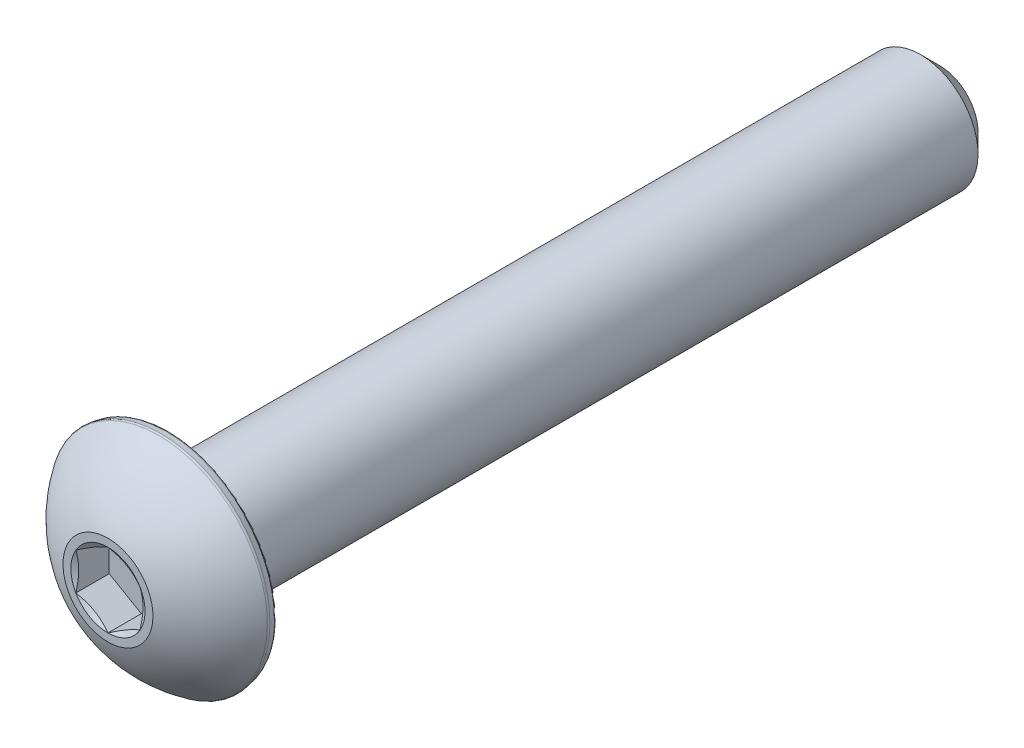
ISO-10303-21;
HEADER;
FILE_DESCRIPTION(('STEP AP214'),'2;1');
FILE_NAME('part.step','',(''),(''),'','','');
FILE_SCHEMA(('AUTOMOTIVE_DESIGN { 1 0 10303 214 1 1 1 1 }'));
ENDSEC;
DATA;
#1=APPLICATION_CONTEXT('core data for automotive mechanical design processes');
#2=APPLICATION_PROTOCOL_DEFINITION('international standard','automotive_design',2000,#1);
#3=PRODUCT_CONTEXT('',#1,'mechanical');
#4=PRODUCT('Part','Part','',(#3));
#5=PRODUCT_RELATED_PRODUCT_CATEGORY('part','',(#4));
#6=PRODUCT_DEFINITION_FORMATION('','',#4);
#7=PRODUCT_DEFINITION_CONTEXT('part definition',#1,'design');
#8=PRODUCT_DEFINITION('design','',#6,#7);
#9=PRODUCT_DEFINITION_SHAPE('','',#8);
#10=(LENGTH_UNIT() NAMED_UNIT(*) SI_UNIT(.MILLI.,.METRE.));
#11=(NAMED_UNIT(*) PLANE_ANGLE_UNIT() SI_UNIT($,.RADIAN.));
#12=(NAMED_UNIT(*) SI_UNIT($,.STERADIAN.) SOLID_ANGLE_UNIT());
#13=UNCERTAINTY_MEASURE_WITH_UNIT(LENGTH_MEASURE(1.E-05),#10,'distance_accuracy_value','');
#14=(GEOMETRIC_REPRESENTATION_CONTEXT(3) GLOBAL_UNCERTAINTY_ASSIGNED_CONTEXT((#13)) GLOBAL_UNIT_ASSIGNED_CONTEXT((#10,
#11,#12)) REPRESENTATION_CONTEXT('',''));
#15=CARTESIAN_POINT('',(0.,0.,0.));
#16=DIRECTION('',(0.,0.,1.));
#17=DIRECTION('',(1.,0.,0.));
#18=AXIS2_PLACEMENT_3D('',#15,#16,#17);
#19=CARTESIAN_POINT('',(0.,0.946150000000001,-19.05));
#20=DIRECTION('',(0.,0.,-1.));
#21=DIRECTION('',(0.,1.,0.));
#22=AXIS2_PLACEMENT_3D('',#19,#20,#21);
#23=PLANE('',#22);
#24=CARTESIAN_POINT('',(0.,0.,-19.05));
#25=DIRECTION('',(0.,0.,-1.));
#26=DIRECTION('',(0.,1.,0.));
#27=AXIS2_PLACEMENT_3D('',#24,#25,#26);
#28=CIRCLE('',#27,0.946150000000001);
#29=CARTESIAN_POINT('',(0.,0.946150000000001,-19.05));
#30=VERTEX_POINT('',#29);
#31=EDGE_CURVE('E108',#30,#30,#28,.T.);
#32=ORIENTED_EDGE('',*,*,#31,.T.);
#33=EDGE_LOOP('',(#32));
#34=FACE_BOUND('',#33,.T.);
#35=ADVANCED_FACE('F35',(#34),#23,.T.);
#36=CARTESIAN_POINT('',(0.,0.,-19.05));
#37=DIRECTION('',(0.,0.,1.));
#38=DIRECTION('',(0.,-1.,0.));
#39=AXIS2_PLACEMENT_3D('',#36,#37,#38);
#40=CONICAL_SURFACE('',#39,0.946150000000001,0.785398163397444);
#41=CARTESIAN_POINT('',(0.,0.,-18.57375));
#42=DIRECTION('',(0.,0.,-1.));
#43=DIRECTION('',(0.,1.,0.));
#44=AXIS2_PLACEMENT_3D('',#41,#42,#43);
#45=CIRCLE('',#44,1.4224);
#46=CARTESIAN_POINT('',(0.,1.4224,-18.57375));
#47=VERTEX_POINT('',#46);
#48=EDGE_CURVE('E207',#47,#47,#45,.T.);
#49=ORIENTED_EDGE('',*,*,#48,.T.);
#50=EDGE_LOOP('',(#49));
#51=FACE_BOUND('',#50,.T.);
#52=ORIENTED_EDGE('',*,*,#31,.F.);
#53=EDGE_LOOP('',(#52));
#54=FACE_BOUND('',#53,.T.);
#55=ADVANCED_FACE('F264',(#51,#54),#40,.T.);
#56=CARTESIAN_POINT('',(0.,0.,-19.05));
#57=DIRECTION('',(0.,0.,-1.));
#58=DIRECTION('',(0.,1.,0.));
#59=AXIS2_PLACEMENT_3D('',#56,#57,#58);
#60=CYLINDRICAL_SURFACE('',#59,1.4224);
#61=CARTESIAN_POINT('',(0.,0.,0.));
#62=DIRECTION('',(0.,0.,-1.));
#63=DIRECTION('',(0.,1.,0.));
#64=AXIS2_PLACEMENT_3D('',#61,#62,#63);
#65=CIRCLE('',#64,1.4224);
#66=CARTESIAN_POINT('',(0.,1.4224,0.));
#67=VERTEX_POINT('',#66);
#68=EDGE_CURVE('E205',#67,#67,#65,.T.);
#69=ORIENTED_EDGE('',*,*,#68,.T.);
#70=EDGE_LOOP('',(#69));
#71=FACE_BOUND('',#70,.T.);
#72=ORIENTED_EDGE('',*,*,#48,.F.);
#73=EDGE_LOOP('',(#72));
#74=FACE_BOUND('',#73,.T.);
#75=ADVANCED_FACE('F201',(#71,#74),#60,.T.);
#76=CARTESIAN_POINT('',(0.,2.66546345800655,0.));
#77=DIRECTION('',(0.,0.,-1.));
#78=DIRECTION('',(0.,1.,0.));
#79=AXIS2_PLACEMENT_3D('',#76,#77,#78);
#80=PLANE('',#79);
#81=CARTESIAN_POINT('',(0.,0.,0.));
#82=DIRECTION('',(0.,0.,-1.));
#83=DIRECTION('',(0.,1.,0.));
#84=AXIS2_PLACEMENT_3D('',#81,#82,#83);
#85=CIRCLE('',#84,2.60258972264243);
#86=CARTESIAN_POINT('',(0.,2.60258972264243,0.));
#87=VERTEX_POINT('',#86);
#88=EDGE_CURVE('E11',#87,#87,#85,.T.);
#89=ORIENTED_EDGE('',*,*,#88,.T.);
#90=EDGE_LOOP('',(#89));
#91=FACE_BOUND('',#90,.T.);
#92=ORIENTED_EDGE('',*,*,#68,.F.);
#93=EDGE_LOOP('',(#92));
#94=FACE_BOUND('',#93,.T.);
#95=ADVANCED_FACE('F191',(#91,#94),#80,.T.);
#96=CARTESIAN_POINT('',(0.,0.,0.));
#97=DIRECTION('',(0.,0.,1.));
#98=DIRECTION('',(0.,-1.,0.));
#99=AXIS2_PLACEMENT_3D('',#96,#97,#98);
#100=CONICAL_SURFACE('',#99,2.66546345800655,0.174532925199423);
#101=CARTESIAN_POINT('',(0.,0.,0.19559217129088));
#102=DIRECTION('',(0.,0.,-1.));
#103=DIRECTION('',(0.,1.,0.));
#104=AXIS2_PLACEMENT_3D('',#101,#102,#103);
#105=CIRCLE('',#104,2.69995163502048);
#106=CARTESIAN_POINT('',(0.,2.69995163502048,0.19559217129088));
#107=VERTEX_POINT('',#106);
#108=EDGE_CURVE('E175',#107,#107,#105,.T.);
#109=ORIENTED_EDGE('',*,*,#108,.T.);
#110=EDGE_LOOP('',(#109));
#111=FACE_BOUND('',#110,.T.);
#112=CARTESIAN_POINT('',(0.,0.,0.0619185420474167));
#113=DIRECTION('',(0.,0.,-1.));
#114=DIRECTION('',(0.,1.,0.));
#115=AXIS2_PLACEMENT_3D('',#112,#113,#114);
#116=CIRCLE('',#115,2.67638136757564);
#117=CARTESIAN_POINT('',(0.,2.67638136757564,0.0619185420474167));
#118=VERTEX_POINT('',#117);
#119=EDGE_CURVE('E107',#118,#118,#116,.F.);
#120=ORIENTED_EDGE('',*,*,#119,.T.);
#121=EDGE_LOOP('',(#120));
#122=FACE_BOUND('',#121,.T.);
#123=ADVANCED_FACE('F188',(#111,#122),#100,.T.);
#124=CARTESIAN_POINT('',(0.,0.,-1.52590183449652));
#125=DIRECTION('',(0.,0.,-1.));
#126=DIRECTION('',(0.,1.,0.));
#127=AXIS2_PLACEMENT_3D('',#124,#125,#126);
#128=SPHERICAL_SURFACE('',#127,3.22218682099173);
#129=CARTESIAN_POINT('',(0.,0.,0.249898795729773));
#130=DIRECTION('',(0.,0.,-1.));
#131=DIRECTION('',(0.,1.,0.));
#132=AXIS2_PLACEMENT_3D('',#129,#130,#131);
#133=CIRCLE('',#132,2.68868369858946);
#134=CARTESIAN_POINT('',(0.,2.68868369858946,0.249898795729773));
#135=VERTEX_POINT('',#134);
#136=EDGE_CURVE('E43',#135,#135,#133,.F.);
#137=CARTESIAN_POINT('',(0.,0.,1.4986));
#138=DIRECTION('',(0.,0.,-1.));
#139=DIRECTION('',(0.,1.,0.));
#140=AXIS2_PLACEMENT_3D('',#137,#138,#139);
#141=CIRCLE('',#140,1.11125);
#142=CARTESIAN_POINT('',(0.,1.11125,1.4986));
#143=VERTEX_POINT('',#142);
#144=EDGE_CURVE('E208',#143,#143,#141,.T.);
#145=CARTESIAN_POINT('',(0.,2.68868369858946,0.249898795729773));
#146=CARTESIAN_POINT('',(0.,2.67693773680656,0.267683040066382));
#147=CARTESIAN_POINT('',(0.,2.66501527663775,0.285350710907791));
#148=CARTESIAN_POINT('',(0.,2.6408221621064,0.320446023521079));
#149=CARTESIAN_POINT('',(0.,2.62855150774385,0.337873665292958));
#150=CARTESIAN_POINT('',(0.,2.60366680740308,0.372482037688057));
#151=CARTESIAN_POINT('',(0.,2.59105276142485,0.389662768311277));
#152=CARTESIAN_POINT('',(0.,2.56548625237676,0.423770558874972));
#153=CARTESIAN_POINT('',(0.,2.5525337893069,0.440697618815447));
#154=CARTESIAN_POINT('',(0.,2.5262955440074,0.474291401576407));
#155=CARTESIAN_POINT('',(0.,2.51300976177775,0.490958124396893));
#156=CARTESIAN_POINT('',(0.,2.48611010997194,0.524024670806157));
#157=CARTESIAN_POINT('',(0.,2.47249624039578,0.540424494394935));
#158=CARTESIAN_POINT('',(0.,2.44494577418738,0.572950784833038));
#159=CARTESIAN_POINT('',(0.,2.43100917755513,0.589077251682361));
#160=CARTESIAN_POINT('',(0.,2.40281874478761,0.621050478898134));
#161=CARTESIAN_POINT('',(0.,2.38856490865234,0.636897239264583));
#162=CARTESIAN_POINT('',(0.,2.35974560929366,0.668304813870195));
#163=CARTESIAN_POINT('',(0.,2.34518014607025,0.683865628109359));
#164=CARTESIAN_POINT('',(0.,2.31574332766643,0.714695183416203));
#165=CARTESIAN_POINT('',(0.,2.30087197248603,0.729963924483883));
#166=CARTESIAN_POINT('',(0.,2.27082922574022,0.760203321404402));
#167=CARTESIAN_POINT('',(0.,2.25565783417481,0.775173977257241));
#168=CARTESIAN_POINT('',(0.,2.22502098837082,0.804811309075978));
#169=CARTESIAN_POINT('',(0.,2.20955553413223,0.819477985041876));
#170=CARTESIAN_POINT('',(0.,2.17833665248014,0.848501582106057));
#171=CARTESIAN_POINT('',(0.,2.16258322506664,0.86285850320434));
#172=CARTESIAN_POINT('',(0.,2.13079459995206,0.891256937518153));
#173=CARTESIAN_POINT('',(0.,2.11475940225098,0.905298450733684));
#174=CARTESIAN_POINT('',(0.,2.08241355039515,0.933060540458206));
#175=CARTESIAN_POINT('',(0.,2.06610289624041,0.946781116967197));
#176=CARTESIAN_POINT('',(0.,2.03321255377174,0.973895930823177));
#177=CARTESIAN_POINT('',(0.,2.0166328654578,0.987290168170166));
#178=CARTESIAN_POINT('',(0.,1.98321098289699,1.01374702974221));
#179=CARTESIAN_POINT('',(0.,1.96636878865011,1.02680965396727));
#180=CARTESIAN_POINT('',(0.,1.93242852581096,1.05259814590768));
#181=CARTESIAN_POINT('',(0.,1.91533045721868,1.06532401362302));
#182=CARTESIAN_POINT('',(0.,1.88088517802639,1.09043398175356));
#183=CARTESIAN_POINT('',(0.,1.86353796742638,1.10281808216875));
#184=CARTESIAN_POINT('',(0.,1.82860123465558,1.1272396394789));
#185=CARTESIAN_POINT('',(0.,1.81101171248478,1.13927709637385));
#186=CARTESIAN_POINT('',(0.,1.77559728241914,1.16300062691373));
#187=CARTESIAN_POINT('',(0.,1.75777237452429,1.17468670055866));
#188=CARTESIAN_POINT('',(0.,1.72189419154007,1.19770286322542));
#189=CARTESIAN_POINT('',(0.,1.7038409164507,1.20903295224724));
#190=CARTESIAN_POINT('',(0.,1.66751310752606,1.23133268446278));
#191=CARTESIAN_POINT('',(0.,1.6492385736908,1.2423023276565));
#192=CARTESIAN_POINT('',(0.,1.61247544284374,1.26387684893691));
#193=CARTESIAN_POINT('',(0.,1.59398684583194,1.27448172702361));
#194=CARTESIAN_POINT('',(0.,1.55680286848659,1.29532254243262));
#195=CARTESIAN_POINT('',(0.,1.53810748815303,1.30555847975494));
#196=CARTESIAN_POINT('',(0.,1.50051730544555,1.32565738326308));
#197=CARTESIAN_POINT('',(0.,1.48162250307163,1.33552034944891));
#198=CARTESIAN_POINT('',(0.,1.44364091606453,1.35486942711133));
#199=CARTESIAN_POINT('',(0.,1.42455413143135,1.36435553858793));
#200=CARTESIAN_POINT('',(0.,1.38619609536316,1.38294717185939));
#201=CARTESIAN_POINT('',(0.,1.36692484392813,1.39205269365425));
#202=CARTESIAN_POINT('',(0.,1.32820546203521,1.40987956164663));
#203=CARTESIAN_POINT('',(0.,1.30875733157731,1.41860090784415));
#204=CARTESIAN_POINT('',(0.,1.26969185022769,1.43565599297924));
#205=CARTESIAN_POINT('',(0.,1.25007449933597,1.4439897319168));
#206=CARTESIAN_POINT('',(0.,1.21067829799299,1.46026631235101));
#207=CARTESIAN_POINT('',(0.,1.19089944754173,1.46820915384765));
#208=CARTESIAN_POINT('',(0.,1.15118804776009,1.48370084470226));
#209=CARTESIAN_POINT('',(0.,1.13125549842972,1.49124969406024));
#210=CARTESIAN_POINT('',(0.,1.11125,1.4986));
#211=B_SPLINE_CURVE_WITH_KNOTS('',3,(#145,#146,#147,#148,#149,#150,#151,#152,#153,#154,#155,
#156,#157,#158,#159,#160,#161,#162,#163,#164,#165,#166,#167,#168,#169,#170,#171,#172,#173,#174,
#175,#176,#177,#178,#179,#180,#181,#182,#183,#184,#185,#186,#187,#188,#189,#190,#191,#192,#193,
#194,#195,#196,#197,#198,#199,#200,#201,#202,#203,#204,#205,#206,#207,#208,#209,#210),
.UNSPECIFIED.,.F.,.F.,(4,2,2,2,2,2,2,2,2,2,2,2,2,2,2,2,2,2,2,2,2,2,2,2,2,2,2,2,2,2,2,2,4),(0.,
0.0639381600922161,0.127876320184432,0.191814480276647,0.255752640368863,0.319690800461078,
0.383628960553294,0.44756712064551,0.511505280737726,0.575443440829941,0.639381600922157,
0.703319761014372,0.767257921106588,0.831196081198804,0.89513424129102,0.959072401383235,
1.02301056147545,1.08694872156767,1.15088688165988,1.2148250417521,1.27876320184431,
1.34270136193653,1.40663952202875,1.47057768212096,1.53451584221318,1.59845400230539,
1.66239216239761,1.72633032248982,1.79026848258204,1.85420664267426,1.91814480276647,
1.98208296285869,2.0460211229509),.UNSPECIFIED.);
#212=EDGE_CURVE('BSEAM180',#135,#143,#211,.T.);
#213=ORIENTED_EDGE('',*,*,#136,.T.);
#214=ORIENTED_EDGE('',*,*,#144,.T.);
#215=ORIENTED_EDGE('',*,*,#212,.T.);
#216=ORIENTED_EDGE('',*,*,#212,.F.);
#217=EDGE_LOOP('',(#213,#215,#214,#216));
#218=FACE_BOUND('',#217,.T.);
#219=ADVANCED_FACE('F180',(#218),#128,.T.);
#220=CARTESIAN_POINT('',(0.,0.,1.4986));
#221=DIRECTION('',(0.,0.,1.));
#222=DIRECTION('',(0.,-1.,0.));
#223=AXIS2_PLACEMENT_3D('',#220,#221,#222);
#224=PLANE('',#223);
#225=CARTESIAN_POINT('',(0.,0.,1.4986));
#226=DIRECTION('',(0.,0.,1.));
#227=DIRECTION('',(1.,0.,0.));
#228=AXIS2_PLACEMENT_3D('',#225,#226,#227);
#229=CIRCLE('',#228,0.916543552338531);
#230=CARTESIAN_POINT('',(0.,-0.916543552338531,1.4986));
#231=VERTEX_POINT('',#230);
#232=CARTESIAN_POINT('',(0.793750000000001,-0.458271776169264,1.4986));
#233=VERTEX_POINT('',#232);
#234=EDGE_CURVE('E56',#231,#233,#229,.T.);
#235=ORIENTED_EDGE('',*,*,#234,.F.);
#236=CARTESIAN_POINT('',(-0.79375,-0.458271776169265,1.4986));
#237=VERTEX_POINT('',#236);
#238=EDGE_CURVE('E133',#237,#231,#229,.T.);
#239=ORIENTED_EDGE('',*,*,#238,.F.);
#240=CARTESIAN_POINT('',(-0.793750000000001,0.458271776169265,1.4986));
#241=VERTEX_POINT('',#240);
#242=EDGE_CURVE('E132',#241,#237,#229,.T.);
#243=ORIENTED_EDGE('',*,*,#242,.F.);
#244=CARTESIAN_POINT('',(0.,0.916543552338531,1.4986));
#245=VERTEX_POINT('',#244);
#246=EDGE_CURVE('E97',#245,#241,#229,.T.);
#247=ORIENTED_EDGE('',*,*,#246,.F.);
#248=CARTESIAN_POINT('',(0.79375,0.458271776169267,1.4986));
#249=VERTEX_POINT('',#248);
#250=EDGE_CURVE('E88',#249,#245,#229,.T.);
#251=ORIENTED_EDGE('',*,*,#250,.F.);
#252=EDGE_CURVE('E49',#233,#249,#229,.T.);
#253=ORIENTED_EDGE('',*,*,#252,.F.);
#254=EDGE_LOOP('',(#235,#239,#243,#247,#251,#253));
#255=FACE_BOUND('',#254,.T.);
#256=ORIENTED_EDGE('',*,*,#144,.F.);
#257=EDGE_LOOP('',(#256));
#258=FACE_BOUND('',#257,.T.);
#259=ADVANCED_FACE('F128',(#255,#258),#224,.T.);
#260=CARTESIAN_POINT('',(0.,0.,1.4986));
#261=DIRECTION('',(0.,0.,1.));
#262=DIRECTION('',(1.,0.,0.));
#263=AXIS2_PLACEMENT_3D('',#260,#261,#262);
#264=CONICAL_SURFACE('',#263,0.916543552338531,1.0471975511966);
#265=ORIENTED_EDGE('',*,*,#246,.T.);
#266=CARTESIAN_POINT('',(0.000199999999999564,0.916659022392369,1.4986666792635));
#267=CARTESIAN_POINT('',(-0.0346838809107489,0.896518804358169,1.48703099698396));
#268=CARTESIAN_POINT('',(-0.0698688716948094,0.876204740457557,1.47644811765243));
#269=CARTESIAN_POINT('',(-0.140848333034132,0.835224729346365,1.45797410083249));
#270=CARTESIAN_POINT('',(-0.176644066385293,0.814558053060232,1.45008950135943));
#271=CARTESIAN_POINT('',(-0.247791832929264,0.77348087089383,1.43781392707612));
#272=CARTESIAN_POINT('',(-0.283132908450752,0.753076691428048,1.43334128653966));
#273=CARTESIAN_POINT('',(-0.35398166090566,0.712172145126457,1.42799834575199));
#274=CARTESIAN_POINT('',(-0.389489079694735,0.691671927330356,1.42712362483003));
#275=CARTESIAN_POINT('',(-0.455857242671567,0.653354250570061,1.4289269676968));
#276=CARTESIAN_POINT('',(-0.486727836837864,0.635531104718106,1.43116224473231));
#277=CARTESIAN_POINT('',(-0.548267868556956,0.60000095083915,1.43825185371756));
#278=CARTESIAN_POINT('',(-0.578937092674118,0.582294066039269,1.4431086160163));
#279=CARTESIAN_POINT('',(-0.640604383568039,0.546690439041469,1.455252149414));
#280=CARTESIAN_POINT('',(-0.671594630816905,0.528798211450083,1.46259048342189));
#281=CARTESIAN_POINT('',(-0.733112462798853,0.493280874595343,1.47924638443405));
#282=CARTESIAN_POINT('',(-0.763640837903604,0.475655309010693,1.48856002860645));
#283=CARTESIAN_POINT('',(-0.793950000000001,0.458156306115427,1.4986666792635));
#284=B_SPLINE_CURVE_WITH_KNOTS('',3,(#266,#267,#268,#269,#270,#271,#272,#273,#274,#275,#276,
#277,#278,#279,#280,#281,#282,#283),.UNSPECIFIED.,.F.,.F.,(4,2,2,2,2,2,2,2,4),(0.,
0.125831544450446,0.25196585895368,0.374977197852896,0.497837350672035,0.604884221554417,
0.712030505252139,0.821555935819832,0.930865859621203),.UNSPECIFIED.);
#285=EDGE_CURVE('E102',#245,#241,#284,.T.);
#286=ORIENTED_EDGE('',*,*,#285,.F.);
#287=EDGE_LOOP('',(#265,#286));
#288=FACE_BOUND('',#287,.T.);
#289=ADVANCED_FACE('F103',(#288),#264,.F.);
#290=ORIENTED_EDGE('',*,*,#242,.T.);
#291=CARTESIAN_POINT('',(-0.79375,-1.18677144013803,1.79374426043695));
#292=CARTESIAN_POINT('',(-0.79375,-1.15249425090075,1.77729754768777));
#293=CARTESIAN_POINT('',(-0.79375,-1.1181340538036,1.76102460229477));
#294=CARTESIAN_POINT('',(-0.79375,-1.04920214850666,1.72891722510026));
#295=CARTESIAN_POINT('',(-0.79375,-1.01463040359119,1.71308287221621));
#296=CARTESIAN_POINT('',(-0.79375,-0.910132321746901,1.66619646615291));
#297=CARTESIAN_POINT('',(-0.79375,-0.839832934007452,1.63596044232956));
#298=CARTESIAN_POINT('',(-0.79375,-0.695986194820959,1.57817011963385));
#299=CARTESIAN_POINT('',(-0.79375,-0.622401957654059,1.55070638545154));
#300=CARTESIAN_POINT('',(-0.79375,-0.473338323217612,1.50183331967557));
#301=CARTESIAN_POINT('',(-0.79375,-0.397864413473054,1.480408269783));
#302=CARTESIAN_POINT('',(-0.79375,-0.283130614252096,1.45555951746641));
#303=CARTESIAN_POINT('',(-0.79375,-0.244668804528151,1.44849460947361));
#304=CARTESIAN_POINT('',(-0.79375,-0.167313666138628,1.43727680521015));
#305=CARTESIAN_POINT('',(-0.79375,-0.128420366814503,1.43312371215303));
#306=CARTESIAN_POINT('',(-0.79375,-0.0508841764284583,1.42811419115554));
#307=CARTESIAN_POINT('',(-0.793750000000001,-0.0122438685217782,1.4272188602277));
#308=CARTESIAN_POINT('',(-0.793750000000001,0.0649726891251611,1.42869680152854));
#309=CARTESIAN_POINT('',(-0.793750000000001,0.103548934750819,1.43107027615113));
#310=CARTESIAN_POINT('',(-0.793750000000001,0.198730861340209,1.44075016783004));
#311=CARTESIAN_POINT('',(-0.793750000000001,0.255152459971145,1.44987054514675));
#312=CARTESIAN_POINT('',(-0.793750000000001,0.366894297671525,1.47339075155196));
#313=CARTESIAN_POINT('',(-0.793750000000001,0.422213124261017,1.48779694365008));
#314=CARTESIAN_POINT('',(-0.793750000000001,0.532936233543623,1.52072159172503));
#315=CARTESIAN_POINT('',(-0.793750000000001,0.588314583643672,1.53932506427659));
#316=CARTESIAN_POINT('',(-0.793750000000001,0.698054165229923,1.57921681225014));
#317=CARTESIAN_POINT('',(-0.793750000000001,0.752415746100402,1.6005041452252));
#318=CARTESIAN_POINT('',(-0.793750000000001,0.890702967537975,1.65739289715127));
#319=CARTESIAN_POINT('',(-0.793750000000001,0.974079171116098,1.69431698370463));
#320=CARTESIAN_POINT('',(-0.793750000000001,1.13963521546854,1.77075901380574));
#321=CARTESIAN_POINT('',(-0.793750000000001,1.22181474269936,1.81027762272302));
#322=CARTESIAN_POINT('',(-0.793750000000001,1.38546612682917,1.89098039190686));
#323=CARTESIAN_POINT('',(-0.793750000000001,1.46693706168936,1.93216641447833));
#324=CARTESIAN_POINT('',(-0.793750000000001,1.62933346530686,2.01560106493078));
#325=CARTESIAN_POINT('',(-0.793750000000001,1.71025891594193,2.05784972789661));
#326=CARTESIAN_POINT('',(-0.793750000000001,1.86409754938322,2.13905222693557));
#327=CARTESIAN_POINT('',(-0.793750000000001,1.93704550606204,2.17794032565034));
#328=CARTESIAN_POINT('',(-0.793750000000001,2.08270675263586,2.25615942774552));
#329=CARTESIAN_POINT('',(-0.793750000000001,2.15542003371734,2.29549044751696));
#330=CARTESIAN_POINT('',(-0.793750000000001,2.30048109320214,2.37438403730803));
#331=CARTESIAN_POINT('',(-0.793750000000001,2.37282933085058,2.41394576391152));
#332=CARTESIAN_POINT('',(-0.793750000000001,2.51737953625172,2.49332670455018));
#333=CARTESIAN_POINT('',(-0.793750000000001,2.58958151146103,2.53314590500192));
#334=CARTESIAN_POINT('',(-0.793750000000001,2.66173093599242,2.57305949905058));
#335=B_SPLINE_CURVE_WITH_KNOTS('',3,(#291,#292,#293,#294,#295,#296,#297,#298,#299,#300,#301,
#302,#303,#304,#305,#306,#307,#308,#309,#310,#311,#312,#313,#314,#315,#316,#317,#318,#319,#320,
#321,#322,#323,#324,#325,#326,#327,#328,#329,#330,#331,#332,#333,#334),.UNSPECIFIED.,.F.,.F.,(4,
2,2,2,2,2,2,2,2,2,2,2,2,2,2,2,2,2,2,2,2,4),(0.,0.114054209284858,0.228128809154428,
0.457644766080035,0.693149720264091,0.928035886813581,1.04526031446353,1.16247681908113,
1.27828888691804,1.39410812578774,1.56521573206963,1.73652999536154,1.91168813862707,
2.08678494492276,2.36025649733381,2.63379845801325,2.90765485023773,3.18152029619272,
3.42951670917399,3.67752233002695,3.92489713692371,4.17225899796758),.UNSPECIFIED.);
#336=EDGE_CURVE('E96',#241,#237,#335,.F.);
#337=ORIENTED_EDGE('',*,*,#336,.F.);
#338=EDGE_LOOP('',(#290,#337));
#339=FACE_BOUND('',#338,.T.);
#340=ADVANCED_FACE('F281',(#339),#264,.F.);
#341=ORIENTED_EDGE('',*,*,#238,.T.);
#342=CARTESIAN_POINT('',(-0.79395,-0.458156306115427,1.4986666792635));
#343=CARTESIAN_POINT('',(-0.759066119089252,-0.478296524149627,1.48703099698396));
#344=CARTESIAN_POINT('',(-0.723881128305191,-0.498610588050239,1.47644811765243));
#345=CARTESIAN_POINT('',(-0.652901666965869,-0.539590599161431,1.45797410083249));
#346=CARTESIAN_POINT('',(-0.617105933614708,-0.560257275447564,1.45008950135943));
#347=CARTESIAN_POINT('',(-0.545958167070737,-0.601334457613966,1.43781392707612));
#348=CARTESIAN_POINT('',(-0.510617091549249,-0.621738637079748,1.43334128653966));
#349=CARTESIAN_POINT('',(-0.439768339094341,-0.662643183381339,1.42799834575199));
#350=CARTESIAN_POINT('',(-0.404260920305265,-0.68314340117744,1.42712362483003));
#351=CARTESIAN_POINT('',(-0.337892757328433,-0.721461077937735,1.4289269676968));
#352=CARTESIAN_POINT('',(-0.307022163162137,-0.73928422378969,1.43116224473231));
#353=CARTESIAN_POINT('',(-0.245482131443044,-0.774814377668646,1.43825185371756));
#354=CARTESIAN_POINT('',(-0.214812907325882,-0.792521262468526,1.4431086160163));
#355=CARTESIAN_POINT('',(-0.153145616431962,-0.828124889466326,1.455252149414));
#356=CARTESIAN_POINT('',(-0.122155369183096,-0.846017117057712,1.46259048342189));
#357=CARTESIAN_POINT('',(-0.0606375372011477,-0.881534453912452,1.47924638443405));
#358=CARTESIAN_POINT('',(-0.0301091620963962,-0.899160019497102,1.48856002860645));
#359=CARTESIAN_POINT('',(0.000200000000000223,-0.916659022392368,1.4986666792635));
#360=B_SPLINE_CURVE_WITH_KNOTS('',3,(#342,#343,#344,#345,#346,#347,#348,#349,#350,#351,#352,
#353,#354,#355,#356,#357,#358,#359),.UNSPECIFIED.,.F.,.F.,(4,2,2,2,2,2,2,2,4),(0.,
0.125831544450446,0.25196585895368,0.374977197852896,0.497837350672035,0.604884221554418,
0.712030505252139,0.821555935819832,0.930865859621203),.UNSPECIFIED.);
#361=EDGE_CURVE('E143',#237,#231,#360,.T.);
#362=ORIENTED_EDGE('',*,*,#361,.F.);
#363=EDGE_LOOP('',(#341,#362));
#364=FACE_BOUND('',#363,.T.);
#365=ADVANCED_FACE('F285',(#364),#264,.F.);
#366=ORIENTED_EDGE('',*,*,#234,.T.);
#367=CARTESIAN_POINT('',(-0.0001999999999997,-0.916659022392369,1.4986666792635));
#368=CARTESIAN_POINT('',(0.0346838809107488,-0.896518804358169,1.48703099698396));
#369=CARTESIAN_POINT('',(0.0698688716948092,-0.876204740457557,1.47644811765243));
#370=CARTESIAN_POINT('',(0.140848333034131,-0.835224729346365,1.45797410083249));
#371=CARTESIAN_POINT('',(0.176644066385293,-0.814558053060232,1.45008950135943));
#372=CARTESIAN_POINT('',(0.247791832929264,-0.773480870893829,1.43781392707612));
#373=CARTESIAN_POINT('',(0.283132908450751,-0.753076691428048,1.43334128653966));
#374=CARTESIAN_POINT('',(0.35398166090566,-0.712172145126457,1.42799834575199));
#375=CARTESIAN_POINT('',(0.389489079694735,-0.691671927330356,1.42712362483003));
#376=CARTESIAN_POINT('',(0.455857242671567,-0.653354250570061,1.4289269676968));
#377=CARTESIAN_POINT('',(0.486727836837863,-0.635531104718106,1.43116224473231));
#378=CARTESIAN_POINT('',(0.548267868556956,-0.60000095083915,1.43825185371756));
#379=CARTESIAN_POINT('',(0.578937092674118,-0.582294066039269,1.4431086160163));
#380=CARTESIAN_POINT('',(0.640604383568038,-0.546690439041469,1.455252149414));
#381=CARTESIAN_POINT('',(0.671594630816904,-0.528798211450083,1.46259048342189));
#382=CARTESIAN_POINT('',(0.733112462798852,-0.493280874595344,1.47924638443405));
#383=CARTESIAN_POINT('',(0.763640837903603,-0.475655309010694,1.48856002860645));
#384=CARTESIAN_POINT('',(0.79395,-0.458156306115427,1.4986666792635));
#385=B_SPLINE_CURVE_WITH_KNOTS('',3,(#367,#368,#369,#370,#371,#372,#373,#374,#375,#376,#377,
#378,#379,#380,#381,#382,#383,#384),.UNSPECIFIED.,.F.,.F.,(4,2,2,2,2,2,2,2,4),(0.,
0.125831544450445,0.25196585895368,0.374977197852896,0.497837350672035,0.604884221554417,
0.712030505252139,0.821555935819832,0.930865859621202),.UNSPECIFIED.);
#386=EDGE_CURVE('E246',#231,#233,#385,.T.);
#387=ORIENTED_EDGE('',*,*,#386,.F.);
#388=EDGE_LOOP('',(#366,#387));
#389=FACE_BOUND('',#388,.T.);
#390=ADVANCED_FACE('F294',(#389),#264,.F.);
#391=ORIENTED_EDGE('',*,*,#252,.T.);
#392=CARTESIAN_POINT('',(0.79375,-1.18677144056487,1.7937442606418));
#393=CARTESIAN_POINT('',(0.79375,-1.15249425131301,1.77729754788379));
#394=CARTESIAN_POINT('',(0.79375,-1.11813405420126,1.76102460248198));
#395=CARTESIAN_POINT('',(0.79375,-1.04920214887507,1.72891722526987));
#396=CARTESIAN_POINT('',(0.79375,-1.01463040394494,1.71308287237706));
#397=CARTESIAN_POINT('',(0.79375,-0.910132322056187,1.66619646628737));
#398=CARTESIAN_POINT('',(0.79375,-0.839832934286801,1.63596044244654));
#399=CARTESIAN_POINT('',(0.79375,-0.695986195038367,1.57817011971628));
#400=CARTESIAN_POINT('',(0.79375,-0.622401957839433,1.55070638551695));
#401=CARTESIAN_POINT('',(0.79375,-0.473338323337498,1.50183331971028));
#402=CARTESIAN_POINT('',(0.79375,-0.397864413559493,1.48040826980401));
#403=CARTESIAN_POINT('',(0.79375,-0.283130614282042,1.45555951747175));
#404=CARTESIAN_POINT('',(0.79375,-0.24466880453577,1.44849460947433));
#405=CARTESIAN_POINT('',(0.79375,-0.167313666101122,1.43727680520509));
#406=CARTESIAN_POINT('',(0.79375,-0.1284203667542,1.43312371214682));
#407=CARTESIAN_POINT('',(0.79375,-0.0508841763229857,1.42811419115101));
#408=CARTESIAN_POINT('',(0.79375,-0.0122438683939352,1.42721886022595));
#409=CARTESIAN_POINT('',(0.79375,0.0649726892973247,1.42869680153604));
#410=CARTESIAN_POINT('',(0.79375,0.103548934944932,1.43107027616512));
#411=CARTESIAN_POINT('',(0.79375,0.198730861570001,1.44075016786188));
#412=CARTESIAN_POINT('',(0.79375,0.255152460214414,1.44987054518958));
#413=CARTESIAN_POINT('',(0.79375,0.36689429794089,1.47339075161711));
#414=CARTESIAN_POINT('',(0.79375,0.422213124543,1.48779694372655));
#415=CARTESIAN_POINT('',(0.79375,0.532936233850986,1.52072159182399));
#416=CARTESIAN_POINT('',(0.79375,0.588314583963784,1.53932506438671));
#417=CARTESIAN_POINT('',(0.79375,0.698054165575433,1.57921681238196));
#418=CARTESIAN_POINT('',(0.793749999999999,0.752415746458564,1.60050414536754));
#419=CARTESIAN_POINT('',(0.793749999999999,0.890702967904533,1.65739289730996));
#420=CARTESIAN_POINT('',(0.793749999999999,0.974079171478975,1.69431698386747));
#421=CARTESIAN_POINT('',(0.793749999999999,1.13963521582481,1.77075901397489));
#422=CARTESIAN_POINT('',(0.793749999999999,1.22181474305271,1.81027762289434));
#423=CARTESIAN_POINT('',(0.793749999999999,1.38546612717705,1.89098039208135));
#424=CARTESIAN_POINT('',(0.793749999999999,1.46693706203469,1.93216641465383));
#425=CARTESIAN_POINT('',(0.793749999999999,1.62933346564738,2.01560106510765));
#426=CARTESIAN_POINT('',(0.793749999999999,1.7102589162802,2.05784972807385));
#427=CARTESIAN_POINT('',(0.793749999999999,1.86409754971945,2.13905222711423));
#428=CARTESIAN_POINT('',(0.793749999999999,1.93704550639844,2.1779403258301));
#429=CARTESIAN_POINT('',(0.793749999999999,2.0827067529727,2.25615942792729));
#430=CARTESIAN_POINT('',(0.793749999999999,2.15542003405446,2.29549044769963));
#431=CARTESIAN_POINT('',(0.793749999999999,2.30048109354011,2.37438403749251));
#432=CARTESIAN_POINT('',(0.793749999999999,2.37282933118913,2.41394576409691));
#433=CARTESIAN_POINT('',(0.793749999999999,2.51737953659151,2.49332670473729));
#434=CARTESIAN_POINT('',(0.793749999999999,2.58958151180146,2.53314590518985));
#435=CARTESIAN_POINT('',(0.793749999999999,2.66173093633351,2.5730594992393));
#436=B_SPLINE_CURVE_WITH_KNOTS('',3,(#392,#393,#394,#395,#396,#397,#398,#399,#400,#401,#402,
#403,#404,#405,#406,#407,#408,#409,#410,#411,#412,#413,#414,#415,#416,#417,#418,#419,#420,#421,
#422,#423,#424,#425,#426,#427,#428,#429,#430,#431,#432,#433,#434,#435),.UNSPECIFIED.,.F.,.F.,(4,
2,2,2,2,2,2,2,2,2,2,2,2,2,2,2,2,2,2,2,2,4),(0.,0.114054209335767,0.228128809256254,
0.457644766285069,0.693149720576996,0.92803588723376,1.04526031495194,1.16247681963767,
1.27828888754124,1.39410812647765,1.56521573280466,1.73652999614182,1.91168813945433,
2.08678494579691,2.36025649820305,2.63379845887744,2.90765485109646,3.18152029704599,
3.42951671002927,3.67752233088423,3.92489713778384,4.17225899883059),.UNSPECIFIED.);
#437=EDGE_CURVE('E118',#233,#249,#436,.T.);
#438=ORIENTED_EDGE('',*,*,#437,.F.);
#439=EDGE_LOOP('',(#391,#438));
#440=FACE_BOUND('',#439,.T.);
#441=ADVANCED_FACE('F288',(#440),#264,.F.);
#442=ORIENTED_EDGE('',*,*,#250,.T.);
#443=CARTESIAN_POINT('',(0.793949999999999,0.458156306115428,1.4986666792635));
#444=CARTESIAN_POINT('',(0.759066119089251,0.478296524149628,1.48703099698396));
#445=CARTESIAN_POINT('',(0.723881128305191,0.49861058805024,1.47644811765243));
#446=CARTESIAN_POINT('',(0.652901666965868,0.539590599161432,1.45797410083249));
#447=CARTESIAN_POINT('',(0.617105933614707,0.560257275447565,1.45008950135943));
#448=CARTESIAN_POINT('',(0.545958167070736,0.601334457613967,1.43781392707612));
#449=CARTESIAN_POINT('',(0.510617091549248,0.621738637079749,1.43334128653966));
#450=CARTESIAN_POINT('',(0.43976833909434,0.662643183381339,1.42799834575199));
#451=CARTESIAN_POINT('',(0.404260920305264,0.683143401177441,1.42712362483003));
#452=CARTESIAN_POINT('',(0.337892757328432,0.721461077937736,1.4289269676968));
#453=CARTESIAN_POINT('',(0.307022163162136,0.73928422378969,1.43116224473231));
#454=CARTESIAN_POINT('',(0.245482131443043,0.774814377668647,1.43825185371756));
#455=CARTESIAN_POINT('',(0.214812907325882,0.792521262468527,1.4431086160163));
#456=CARTESIAN_POINT('',(0.153145616431961,0.828124889466327,1.455252149414));
#457=CARTESIAN_POINT('',(0.122155369183095,0.846017117057713,1.46259048342189));
#458=CARTESIAN_POINT('',(0.0606375372011474,0.881534453912452,1.47924638443405));
#459=CARTESIAN_POINT('',(0.0301091620963958,0.899160019497102,1.48856002860645));
#460=CARTESIAN_POINT('',(-0.000200000000000541,0.916659022392369,1.4986666792635));
#461=B_SPLINE_CURVE_WITH_KNOTS('',3,(#443,#444,#445,#446,#447,#448,#449,#450,#451,#452,#453,
#454,#455,#456,#457,#458,#459,#460),.UNSPECIFIED.,.F.,.F.,(4,2,2,2,2,2,2,2,4),(0.,
0.125831544450446,0.25196585895368,0.374977197852896,0.497837350672035,0.604884221554417,
0.712030505252139,0.821555935819832,0.930865859621202),.UNSPECIFIED.);
#462=EDGE_CURVE('E92',#249,#245,#461,.T.);
#463=ORIENTED_EDGE('',*,*,#462,.F.);
#464=EDGE_LOOP('',(#442,#463));
#465=FACE_BOUND('',#464,.T.);
#466=ADVANCED_FACE('F90',(#465),#264,.F.);
#467=CARTESIAN_POINT('',(0.,0.,0.674369999999999));
#468=DIRECTION('',(0.,0.,1.));
#469=DIRECTION('',(1.,0.,0.));
#470=AXIS2_PLACEMENT_3D('',#467,#468,#469);
#471=PLANE('',#470);
#472=DIRECTION('',(-0.866025403784439,0.499999999999999,0.));
#473=VECTOR('',#472,1.);
#474=CARTESIAN_POINT('',(0.79375,0.458271776169266,0.674369999999999));
#475=LINE('',#474,#473);
#476=CARTESIAN_POINT('',(0.79375,0.458271776169266,0.674369999999999));
#477=VERTEX_POINT('',#476);
#478=CARTESIAN_POINT('',(0.,0.916543552338531,0.674369999999999));
#479=VERTEX_POINT('',#478);
#480=EDGE_CURVE('E117',#477,#479,#475,.T.);
#481=ORIENTED_EDGE('',*,*,#480,.T.);
#482=DIRECTION('',(-0.866025403784438,-0.5,0.));
#483=VECTOR('',#482,1.);
#484=CARTESIAN_POINT('',(0.,0.916543552338531,0.674369999999999));
#485=LINE('',#484,#483);
#486=CARTESIAN_POINT('',(-0.793750000000001,0.458271776169265,0.674369999999999));
#487=VERTEX_POINT('',#486);
#488=EDGE_CURVE('E122',#479,#487,#485,.T.);
#489=ORIENTED_EDGE('',*,*,#488,.T.);
#490=DIRECTION('',(0.,-1.,0.));
#491=VECTOR('',#490,1.);
#492=CARTESIAN_POINT('',(-0.793750000000001,0.458271776169265,0.674369999999999));
#493=LINE('',#492,#491);
#494=CARTESIAN_POINT('',(-0.79375,-0.458271776169265,0.674369999999999));
#495=VERTEX_POINT('',#494);
#496=EDGE_CURVE('E232',#487,#495,#493,.T.);
#497=ORIENTED_EDGE('',*,*,#496,.T.);
#498=DIRECTION('',(0.866025403784439,-0.5,0.));
#499=VECTOR('',#498,1.);
#500=CARTESIAN_POINT('',(-0.79375,-0.458271776169265,0.674369999999999));
#501=LINE('',#500,#499);
#502=CARTESIAN_POINT('',(0.,-0.916543552338531,0.674369999999999));
#503=VERTEX_POINT('',#502);
#504=EDGE_CURVE('E229',#495,#503,#501,.T.);
#505=ORIENTED_EDGE('',*,*,#504,.T.);
#506=DIRECTION('',(0.866025403784438,0.500000000000001,0.));
#507=VECTOR('',#506,1.);
#508=CARTESIAN_POINT('',(0.,-0.916543552338531,0.674369999999999));
#509=LINE('',#508,#507);
#510=CARTESIAN_POINT('',(0.79375,-0.458271776169265,0.674369999999999));
#511=VERTEX_POINT('',#510);
#512=EDGE_CURVE('E226',#503,#511,#509,.T.);
#513=ORIENTED_EDGE('',*,*,#512,.T.);
#514=DIRECTION('',(0.,1.,0.));
#515=VECTOR('',#514,1.);
#516=CARTESIAN_POINT('',(0.79375,-0.458271776169265,0.674369999999999));
#517=LINE('',#516,#515);
#518=EDGE_CURVE('E125',#511,#477,#517,.T.);
#519=ORIENTED_EDGE('',*,*,#518,.T.);
#520=EDGE_LOOP('',(#481,#489,#497,#505,#513,#519));
#521=FACE_BOUND('',#520,.T.);
#522=ADVANCED_FACE('F163',(#521),#471,.T.);
#523=CARTESIAN_POINT('',(0.,0.916543552338531,0.674369999999999));
#524=DIRECTION('',(-0.5,0.866025403784438,0.));
#525=DIRECTION('',(-0.866025403784438,-0.5,0.));
#526=AXIS2_PLACEMENT_3D('',#523,#524,#525);
#527=PLANE('',#526);
#528=DIRECTION('',(0.,0.,1.));
#529=VECTOR('',#528,1.);
#530=CARTESIAN_POINT('',(0.,0.916543552338531,0.674369999999999));
#531=LINE('',#530,#529);
#532=EDGE_CURVE('E114',#479,#245,#531,.T.);
#533=ORIENTED_EDGE('',*,*,#532,.T.);
#534=ORIENTED_EDGE('',*,*,#285,.T.);
#535=DIRECTION('',(0.,0.,1.));
#536=VECTOR('',#535,1.);
#537=CARTESIAN_POINT('',(-0.793750000000001,0.458271776169265,0.674369999999999));
#538=LINE('',#537,#536);
#539=EDGE_CURVE('E124',#487,#241,#538,.T.);
#540=ORIENTED_EDGE('',*,*,#539,.F.);
#541=ORIENTED_EDGE('',*,*,#488,.F.);
#542=EDGE_LOOP('',(#533,#534,#540,#541));
#543=FACE_BOUND('',#542,.T.);
#544=ADVANCED_FACE('F120',(#543),#527,.F.);
#545=CARTESIAN_POINT('',(-0.793750000000001,0.458271776169265,0.674369999999999));
#546=DIRECTION('',(-1.,0.,0.));
#547=DIRECTION('',(0.,-1.,0.));
#548=AXIS2_PLACEMENT_3D('',#545,#546,#547);
#549=PLANE('',#548);
#550=ORIENTED_EDGE('',*,*,#539,.T.);
#551=ORIENTED_EDGE('',*,*,#336,.T.);
#552=DIRECTION('',(0.,0.,1.));
#553=VECTOR('',#552,1.);
#554=CARTESIAN_POINT('',(-0.79375,-0.458271776169265,0.674369999999999));
#555=LINE('',#554,#553);
#556=EDGE_CURVE('E215',#495,#237,#555,.T.);
#557=ORIENTED_EDGE('',*,*,#556,.F.);
#558=ORIENTED_EDGE('',*,*,#496,.F.);
#559=EDGE_LOOP('',(#550,#551,#557,#558));
#560=FACE_BOUND('',#559,.T.);
#561=ADVANCED_FACE('F152',(#560),#549,.F.);
#562=CARTESIAN_POINT('',(-0.79375,-0.458271776169265,0.674369999999999));
#563=DIRECTION('',(-0.5,-0.866025403784439,0.));
#564=DIRECTION('',(0.866025403784439,-0.5,0.));
#565=AXIS2_PLACEMENT_3D('',#562,#563,#564);
#566=PLANE('',#565);
#567=ORIENTED_EDGE('',*,*,#556,.T.);
#568=ORIENTED_EDGE('',*,*,#361,.T.);
#569=DIRECTION('',(0.,0.,1.));
#570=VECTOR('',#569,1.);
#571=CARTESIAN_POINT('',(0.,-0.916543552338531,0.674369999999999));
#572=LINE('',#571,#570);
#573=EDGE_CURVE('E217',#503,#231,#572,.T.);
#574=ORIENTED_EDGE('',*,*,#573,.F.);
#575=ORIENTED_EDGE('',*,*,#504,.F.);
#576=EDGE_LOOP('',(#567,#568,#574,#575));
#577=FACE_BOUND('',#576,.T.);
#578=ADVANCED_FACE('F156',(#577),#566,.F.);
#579=CARTESIAN_POINT('',(0.,-0.916543552338531,0.674369999999999));
#580=DIRECTION('',(0.500000000000001,-0.866025403784438,0.));
#581=DIRECTION('',(0.866025403784438,0.500000000000001,0.));
#582=AXIS2_PLACEMENT_3D('',#579,#580,#581);
#583=PLANE('',#582);
#584=ORIENTED_EDGE('',*,*,#573,.T.);
#585=ORIENTED_EDGE('',*,*,#386,.T.);
#586=DIRECTION('',(0.,0.,1.));
#587=VECTOR('',#586,1.);
#588=CARTESIAN_POINT('',(0.79375,-0.458271776169265,0.674369999999999));
#589=LINE('',#588,#587);
#590=EDGE_CURVE('E220',#511,#233,#589,.T.);
#591=ORIENTED_EDGE('',*,*,#590,.F.);
#592=ORIENTED_EDGE('',*,*,#512,.F.);
#593=EDGE_LOOP('',(#584,#585,#591,#592));
#594=FACE_BOUND('',#593,.T.);
#595=ADVANCED_FACE('F254',(#594),#583,.F.);
#596=CARTESIAN_POINT('',(0.79375,-0.458271776169265,0.674369999999999));
#597=DIRECTION('',(1.,0.,0.));
#598=DIRECTION('',(0.,1.,0.));
#599=AXIS2_PLACEMENT_3D('',#596,#597,#598);
#600=PLANE('',#599);
#601=ORIENTED_EDGE('',*,*,#590,.T.);
#602=ORIENTED_EDGE('',*,*,#437,.T.);
#603=DIRECTION('',(0.,0.,1.));
#604=VECTOR('',#603,1.);
#605=CARTESIAN_POINT('',(0.79375,0.458271776169266,0.674369999999999));
#606=LINE('',#605,#604);
#607=EDGE_CURVE('E116',#477,#249,#606,.T.);
#608=ORIENTED_EDGE('',*,*,#607,.F.);
#609=ORIENTED_EDGE('',*,*,#518,.F.);
#610=EDGE_LOOP('',(#601,#602,#608,#609));
#611=FACE_BOUND('',#610,.T.);
#612=ADVANCED_FACE('F251',(#611),#600,.F.);
#613=CARTESIAN_POINT('',(0.79375,0.458271776169266,0.674369999999999));
#614=DIRECTION('',(0.499999999999999,0.866025403784439,0.));
#615=DIRECTION('',(-0.866025403784439,0.499999999999999,0.));
#616=AXIS2_PLACEMENT_3D('',#613,#614,#615);
#617=PLANE('',#616);
#618=ORIENTED_EDGE('',*,*,#607,.T.);
#619=ORIENTED_EDGE('',*,*,#462,.T.);
#620=ORIENTED_EDGE('',*,*,#532,.F.);
#621=ORIENTED_EDGE('',*,*,#480,.F.);
#622=EDGE_LOOP('',(#618,#619,#620,#621));
#623=FACE_BOUND('',#622,.T.);
#624=ADVANCED_FACE('F112',(#623),#617,.F.);
#625=CARTESIAN_POINT('',(0.,0.,0.208603629243465));
#626=DIRECTION('',(0.,0.,-1.));
#627=DIRECTION('',(0.,1.,0.));
#628=AXIS2_PLACEMENT_3D('',#625,#626,#627);
#629=TOROIDAL_SURFACE('',#628,2.62615999008727,0.07493);
#630=ORIENTED_EDGE('',*,*,#136,.F.);
#631=EDGE_LOOP('',(#630));
#632=FACE_BOUND('',#631,.T.);
#633=ORIENTED_EDGE('',*,*,#108,.F.);
#634=EDGE_LOOP('',(#633));
#635=FACE_BOUND('',#634,.T.);
#636=ADVANCED_FACE('F183',(#632,#635),#629,.T.);
#637=CARTESIAN_POINT('',(0.,0.,0.0749300000000008));
#638=DIRECTION('',(0.,0.,-1.));
#639=DIRECTION('',(0.,1.,0.));
#640=AXIS2_PLACEMENT_3D('',#637,#638,#639);
#641=TOROIDAL_SURFACE('',#640,2.60258972264243,0.07493);
#642=ORIENTED_EDGE('',*,*,#119,.F.);
#643=EDGE_LOOP('',(#642));
#644=FACE_BOUND('',#643,.T.);
#645=ORIENTED_EDGE('',*,*,#88,.F.);
#646=EDGE_LOOP('',(#645));
#647=FACE_BOUND('',#646,.T.);
#648=ADVANCED_FACE('F37',(#644,#647),#641,.T.);
#649=CLOSED_SHELL('',(#35,#55,#75,#95,#123,#219,#259,#289,#340,#365,#390,#441,#466,#522,#544,
#561,#578,#595,#612,#624,#636,#648));
#650=MANIFOLD_SOLID_BREP('B2',#649);
#651=ADVANCED_BREP_SHAPE_REPRESENTATION('',(#18,#650),#14);
#652=SHAPE_DEFINITION_REPRESENTATION(#9,#651);
ENDSEC;
END-ISO-10303-21;
